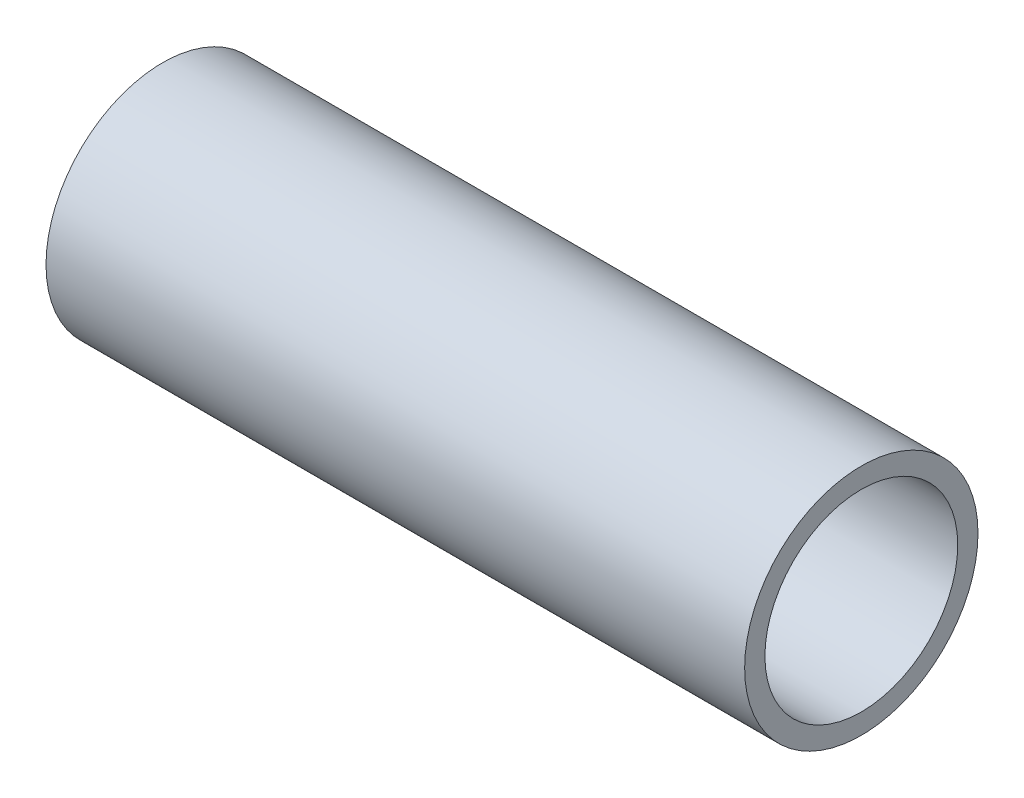
ISO-10303-21;
HEADER;
FILE_DESCRIPTION(('STEP AP214'),'2;1');
FILE_NAME('part.step','',(''),(''),'','','');
FILE_SCHEMA(('AUTOMOTIVE_DESIGN { 1 0 10303 214 1 1 1 1 }'));
ENDSEC;
DATA;
#1=APPLICATION_CONTEXT('core data for automotive mechanical design processes');
#2=APPLICATION_PROTOCOL_DEFINITION('international standard','automotive_design',2000,#1);
#3=PRODUCT_CONTEXT('',#1,'mechanical');
#4=PRODUCT('Part','Part','',(#3));
#5=PRODUCT_RELATED_PRODUCT_CATEGORY('part','',(#4));
#6=PRODUCT_DEFINITION_FORMATION('','',#4);
#7=PRODUCT_DEFINITION_CONTEXT('part definition',#1,'design');
#8=PRODUCT_DEFINITION('design','',#6,#7);
#9=PRODUCT_DEFINITION_SHAPE('','',#8);
#10=(LENGTH_UNIT() NAMED_UNIT(*) SI_UNIT(.MILLI.,.METRE.));
#11=(NAMED_UNIT(*) PLANE_ANGLE_UNIT() SI_UNIT($,.RADIAN.));
#12=(NAMED_UNIT(*) SI_UNIT($,.STERADIAN.) SOLID_ANGLE_UNIT());
#13=UNCERTAINTY_MEASURE_WITH_UNIT(LENGTH_MEASURE(1.E-05),#10,'distance_accuracy_value','');
#14=(GEOMETRIC_REPRESENTATION_CONTEXT(3) GLOBAL_UNCERTAINTY_ASSIGNED_CONTEXT((#13)) GLOBAL_UNIT_ASSIGNED_CONTEXT((#10,
#11,#12)) REPRESENTATION_CONTEXT('',''));
#15=CARTESIAN_POINT('',(0.,0.,0.));
#16=DIRECTION('',(0.,0.,1.));
#17=DIRECTION('',(1.,0.,0.));
#18=AXIS2_PLACEMENT_3D('',#15,#16,#17);
#19=CARTESIAN_POINT('',(100.,0.,0.));
#20=DIRECTION('',(1.,0.,0.));
#21=DIRECTION('',(0.,0.,-1.));
#22=AXIS2_PLACEMENT_3D('',#19,#20,#21);
#23=PLANE('',#22);
#24=CARTESIAN_POINT('',(100.,0.,0.));
#25=DIRECTION('',(1.,0.,0.));
#26=DIRECTION('',(0.,0.,-1.));
#27=AXIS2_PLACEMENT_3D('',#24,#25,#26);
#28=CIRCLE('',#27,16.7);
#29=CARTESIAN_POINT('',(100.,0.,-16.7));
#30=VERTEX_POINT('',#29);
#31=EDGE_CURVE('E10',#30,#30,#28,.T.);
#32=ORIENTED_EDGE('',*,*,#31,.T.);
#33=EDGE_LOOP('',(#32));
#34=FACE_BOUND('',#33,.T.);
#35=CARTESIAN_POINT('',(100.,0.,0.));
#36=DIRECTION('',(1.,0.,0.));
#37=DIRECTION('',(0.,0.,-1.));
#38=AXIS2_PLACEMENT_3D('',#35,#36,#37);
#39=CIRCLE('',#38,13.8);
#40=CARTESIAN_POINT('',(100.,0.,-13.8));
#41=VERTEX_POINT('',#40);
#42=EDGE_CURVE('E44',#41,#41,#39,.T.);
#43=ORIENTED_EDGE('',*,*,#42,.F.);
#44=EDGE_LOOP('',(#43));
#45=FACE_BOUND('',#44,.T.);
#46=ADVANCED_FACE('F33',(#34,#45),#23,.T.);
#47=CARTESIAN_POINT('',(0.,0.,0.));
#48=DIRECTION('',(1.,0.,0.));
#49=DIRECTION('',(0.,0.,-1.));
#50=AXIS2_PLACEMENT_3D('',#47,#48,#49);
#51=PLANE('',#50);
#52=CARTESIAN_POINT('',(0.,0.,0.));
#53=DIRECTION('',(1.,0.,0.));
#54=DIRECTION('',(0.,0.,-1.));
#55=AXIS2_PLACEMENT_3D('',#52,#53,#54);
#56=CIRCLE('',#55,16.7);
#57=CARTESIAN_POINT('',(0.,0.,-16.7));
#58=VERTEX_POINT('',#57);
#59=EDGE_CURVE('E37',#58,#58,#56,.T.);
#60=ORIENTED_EDGE('',*,*,#59,.F.);
#61=EDGE_LOOP('',(#60));
#62=FACE_BOUND('',#61,.T.);
#63=CARTESIAN_POINT('',(0.,0.,0.));
#64=DIRECTION('',(1.,0.,0.));
#65=DIRECTION('',(0.,0.,-1.));
#66=AXIS2_PLACEMENT_3D('',#63,#64,#65);
#67=CIRCLE('',#66,13.8);
#68=CARTESIAN_POINT('',(0.,0.,-13.8));
#69=VERTEX_POINT('',#68);
#70=EDGE_CURVE('E46',#69,#69,#67,.T.);
#71=ORIENTED_EDGE('',*,*,#70,.T.);
#72=EDGE_LOOP('',(#71));
#73=FACE_BOUND('',#72,.T.);
#74=ADVANCED_FACE('F56',(#62,#73),#51,.F.);
#75=CARTESIAN_POINT('',(100.,0.,0.));
#76=DIRECTION('',(-1.,0.,0.));
#77=DIRECTION('',(0.,0.,1.));
#78=AXIS2_PLACEMENT_3D('',#75,#76,#77);
#79=CYLINDRICAL_SURFACE('',#78,16.7);
#80=ORIENTED_EDGE('',*,*,#31,.F.);
#81=EDGE_LOOP('',(#80));
#82=FACE_BOUND('',#81,.T.);
#83=ORIENTED_EDGE('',*,*,#59,.T.);
#84=EDGE_LOOP('',(#83));
#85=FACE_BOUND('',#84,.T.);
#86=ADVANCED_FACE('F35',(#82,#85),#79,.T.);
#87=CARTESIAN_POINT('',(100.,0.,0.));
#88=DIRECTION('',(-1.,0.,0.));
#89=DIRECTION('',(0.,0.,1.));
#90=AXIS2_PLACEMENT_3D('',#87,#88,#89);
#91=CYLINDRICAL_SURFACE('',#90,13.8);
#92=ORIENTED_EDGE('',*,*,#42,.T.);
#93=EDGE_LOOP('',(#92));
#94=FACE_BOUND('',#93,.T.);
#95=ORIENTED_EDGE('',*,*,#70,.F.);
#96=EDGE_LOOP('',(#95));
#97=FACE_BOUND('',#96,.T.);
#98=ADVANCED_FACE('F52',(#94,#97),#91,.F.);
#99=CLOSED_SHELL('',(#46,#74,#86,#98));
#100=MANIFOLD_SOLID_BREP('B2',#99);
#101=ADVANCED_BREP_SHAPE_REPRESENTATION('',(#18,#100),#14);
#102=SHAPE_DEFINITION_REPRESENTATION(#9,#101);
ENDSEC;
END-ISO-10303-21;
